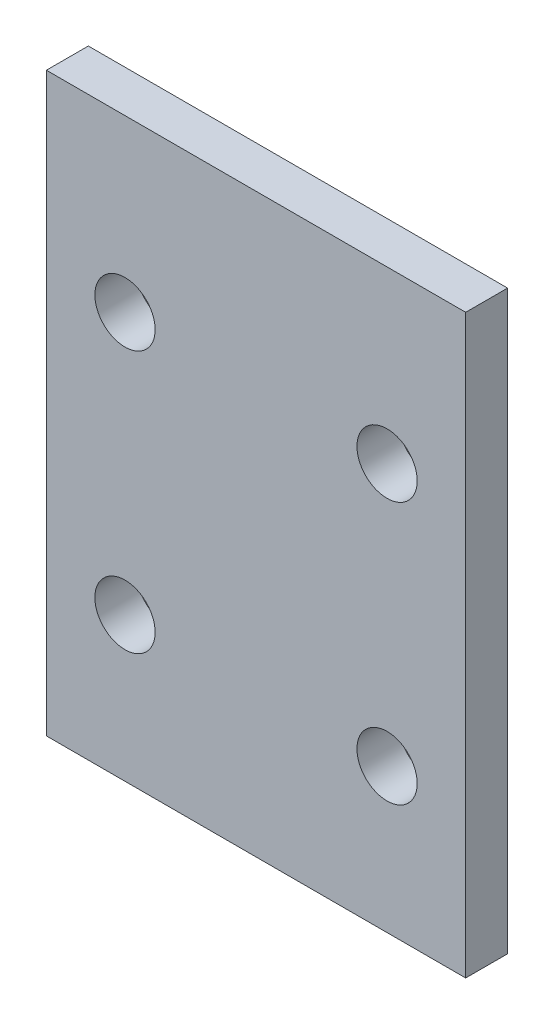
ISO-10303-21;
HEADER;
FILE_DESCRIPTION(('STEP AP214'),'2;1');
FILE_NAME('part.step','',(''),(''),'','','');
FILE_SCHEMA(('AUTOMOTIVE_DESIGN { 1 0 10303 214 1 1 1 1 }'));
ENDSEC;
DATA;
#1=APPLICATION_CONTEXT('core data for automotive mechanical design processes');
#2=APPLICATION_PROTOCOL_DEFINITION('international standard','automotive_design',2000,#1);
#3=PRODUCT_CONTEXT('',#1,'mechanical');
#4=PRODUCT('Part','Part','',(#3));
#5=PRODUCT_RELATED_PRODUCT_CATEGORY('part','',(#4));
#6=PRODUCT_DEFINITION_FORMATION('','',#4);
#7=PRODUCT_DEFINITION_CONTEXT('part definition',#1,'design');
#8=PRODUCT_DEFINITION('design','',#6,#7);
#9=PRODUCT_DEFINITION_SHAPE('','',#8);
#10=(LENGTH_UNIT() NAMED_UNIT(*) SI_UNIT(.MILLI.,.METRE.));
#11=(NAMED_UNIT(*) PLANE_ANGLE_UNIT() SI_UNIT($,.RADIAN.));
#12=(NAMED_UNIT(*) SI_UNIT($,.STERADIAN.) SOLID_ANGLE_UNIT());
#13=UNCERTAINTY_MEASURE_WITH_UNIT(LENGTH_MEASURE(1.E-05),#10,'distance_accuracy_value','');
#14=(GEOMETRIC_REPRESENTATION_CONTEXT(3) GLOBAL_UNCERTAINTY_ASSIGNED_CONTEXT((#13)) GLOBAL_UNIT_ASSIGNED_CONTEXT((#10,
#11,#12)) REPRESENTATION_CONTEXT('',''));
#15=CARTESIAN_POINT('',(0.,0.,0.));
#16=DIRECTION('',(0.,0.,1.));
#17=DIRECTION('',(1.,0.,0.));
#18=AXIS2_PLACEMENT_3D('',#15,#16,#17);
#19=CARTESIAN_POINT('',(0.,0.,16.));
#20=DIRECTION('',(-1.,0.,0.));
#21=DIRECTION('',(0.,0.,-1.));
#22=AXIS2_PLACEMENT_3D('',#19,#20,#21);
#23=PLANE('',#22);
#24=DIRECTION('',(0.,-1.,0.));
#25=VECTOR('',#24,1.);
#26=CARTESIAN_POINT('',(0.,0.,0.));
#27=LINE('',#26,#25);
#28=CARTESIAN_POINT('',(0.,0.,0.));
#29=VERTEX_POINT('',#28);
#30=CARTESIAN_POINT('',(0.,-220.,0.));
#31=VERTEX_POINT('',#30);
#32=EDGE_CURVE('E103',#29,#31,#27,.T.);
#33=ORIENTED_EDGE('',*,*,#32,.T.);
#34=DIRECTION('',(0.,0.,-1.));
#35=VECTOR('',#34,1.);
#36=CARTESIAN_POINT('',(0.,-220.,16.));
#37=LINE('',#36,#35);
#38=CARTESIAN_POINT('',(0.,-220.,16.));
#39=VERTEX_POINT('',#38);
#40=EDGE_CURVE('E96',#39,#31,#37,.T.);
#41=ORIENTED_EDGE('',*,*,#40,.F.);
#42=DIRECTION('',(0.,-1.,0.));
#43=VECTOR('',#42,1.);
#44=CARTESIAN_POINT('',(0.,0.,16.));
#45=LINE('',#44,#43);
#46=CARTESIAN_POINT('',(0.,0.,16.));
#47=VERTEX_POINT('',#46);
#48=EDGE_CURVE('E90',#47,#39,#45,.T.);
#49=ORIENTED_EDGE('',*,*,#48,.F.);
#50=DIRECTION('',(0.,0.,-1.));
#51=VECTOR('',#50,1.);
#52=CARTESIAN_POINT('',(0.,0.,16.));
#53=LINE('',#52,#51);
#54=EDGE_CURVE('E11',#47,#29,#53,.T.);
#55=ORIENTED_EDGE('',*,*,#54,.T.);
#56=EDGE_LOOP('',(#33,#41,#49,#55));
#57=FACE_BOUND('',#56,.T.);
#58=ADVANCED_FACE('F37',(#57),#23,.T.);
#59=CARTESIAN_POINT('',(0.,0.,16.));
#60=DIRECTION('',(0.,1.,0.));
#61=DIRECTION('',(0.,0.,-1.));
#62=AXIS2_PLACEMENT_3D('',#59,#60,#61);
#63=PLANE('',#62);
#64=DIRECTION('',(-1.,0.,0.));
#65=VECTOR('',#64,1.);
#66=CARTESIAN_POINT('',(0.,0.,0.));
#67=LINE('',#66,#65);
#68=CARTESIAN_POINT('',(160.,0.,0.));
#69=VERTEX_POINT('',#68);
#70=EDGE_CURVE('E78',#69,#29,#67,.T.);
#71=ORIENTED_EDGE('',*,*,#70,.T.);
#72=ORIENTED_EDGE('',*,*,#54,.F.);
#73=DIRECTION('',(-1.,0.,0.));
#74=VECTOR('',#73,1.);
#75=CARTESIAN_POINT('',(0.,0.,16.));
#76=LINE('',#75,#74);
#77=CARTESIAN_POINT('',(160.,0.,16.));
#78=VERTEX_POINT('',#77);
#79=EDGE_CURVE('E55',#78,#47,#76,.T.);
#80=ORIENTED_EDGE('',*,*,#79,.F.);
#81=DIRECTION('',(0.,0.,-1.));
#82=VECTOR('',#81,1.);
#83=CARTESIAN_POINT('',(160.,0.,16.));
#84=LINE('',#83,#82);
#85=EDGE_CURVE('E46',#78,#69,#84,.T.);
#86=ORIENTED_EDGE('',*,*,#85,.T.);
#87=EDGE_LOOP('',(#71,#72,#80,#86));
#88=FACE_BOUND('',#87,.T.);
#89=ADVANCED_FACE('F163',(#88),#63,.T.);
#90=CARTESIAN_POINT('',(160.,0.,16.));
#91=DIRECTION('',(1.,0.,0.));
#92=DIRECTION('',(0.,0.,1.));
#93=AXIS2_PLACEMENT_3D('',#90,#91,#92);
#94=PLANE('',#93);
#95=DIRECTION('',(0.,1.,0.));
#96=VECTOR('',#95,1.);
#97=CARTESIAN_POINT('',(160.,0.,0.));
#98=LINE('',#97,#96);
#99=CARTESIAN_POINT('',(160.,-220.,0.));
#100=VERTEX_POINT('',#99);
#101=EDGE_CURVE('E72',#100,#69,#98,.T.);
#102=ORIENTED_EDGE('',*,*,#101,.T.);
#103=ORIENTED_EDGE('',*,*,#85,.F.);
#104=DIRECTION('',(0.,1.,0.));
#105=VECTOR('',#104,1.);
#106=CARTESIAN_POINT('',(160.,0.,16.));
#107=LINE('',#106,#105);
#108=CARTESIAN_POINT('',(160.,-220.,16.));
#109=VERTEX_POINT('',#108);
#110=EDGE_CURVE('E88',#109,#78,#107,.T.);
#111=ORIENTED_EDGE('',*,*,#110,.F.);
#112=DIRECTION('',(0.,0.,-1.));
#113=VECTOR('',#112,1.);
#114=CARTESIAN_POINT('',(160.,-220.,16.));
#115=LINE('',#114,#113);
#116=EDGE_CURVE('E93',#109,#100,#115,.T.);
#117=ORIENTED_EDGE('',*,*,#116,.T.);
#118=EDGE_LOOP('',(#102,#103,#111,#117));
#119=FACE_BOUND('',#118,.T.);
#120=ADVANCED_FACE('F98',(#119),#94,.T.);
#121=CARTESIAN_POINT('',(0.,-220.,16.));
#122=DIRECTION('',(0.,-1.,0.));
#123=DIRECTION('',(0.,0.,1.));
#124=AXIS2_PLACEMENT_3D('',#121,#122,#123);
#125=PLANE('',#124);
#126=DIRECTION('',(1.,0.,0.));
#127=VECTOR('',#126,1.);
#128=CARTESIAN_POINT('',(0.,-220.,0.));
#129=LINE('',#128,#127);
#130=EDGE_CURVE('E95',#31,#100,#129,.T.);
#131=ORIENTED_EDGE('',*,*,#130,.T.);
#132=ORIENTED_EDGE('',*,*,#116,.F.);
#133=DIRECTION('',(1.,0.,0.));
#134=VECTOR('',#133,1.);
#135=CARTESIAN_POINT('',(0.,-220.,16.));
#136=LINE('',#135,#134);
#137=EDGE_CURVE('E85',#39,#109,#136,.T.);
#138=ORIENTED_EDGE('',*,*,#137,.F.);
#139=ORIENTED_EDGE('',*,*,#40,.T.);
#140=EDGE_LOOP('',(#131,#132,#138,#139));
#141=FACE_BOUND('',#140,.T.);
#142=ADVANCED_FACE('F94',(#141),#125,.T.);
#143=CARTESIAN_POINT('',(0.,0.,16.));
#144=DIRECTION('',(0.,0.,-1.));
#145=DIRECTION('',(1.,0.,0.));
#146=AXIS2_PLACEMENT_3D('',#143,#144,#145);
#147=PLANE('',#146);
#148=CARTESIAN_POINT('',(30.0000000000004,-65.,16.));
#149=DIRECTION('',(0.,0.,-1.));
#150=DIRECTION('',(-1.,0.,0.));
#151=AXIS2_PLACEMENT_3D('',#148,#149,#150);
#152=CIRCLE('',#151,11.5);
#153=CARTESIAN_POINT('',(18.5000000000003,-65.,16.));
#154=VERTEX_POINT('',#153);
#155=EDGE_CURVE('E133',#154,#154,#152,.T.);
#156=ORIENTED_EDGE('',*,*,#155,.T.);
#157=EDGE_LOOP('',(#156));
#158=FACE_BOUND('',#157,.T.);
#159=CARTESIAN_POINT('',(130.,-165.,16.));
#160=DIRECTION('',(0.,0.,-1.));
#161=DIRECTION('',(1.,0.,0.));
#162=AXIS2_PLACEMENT_3D('',#159,#160,#161);
#163=CIRCLE('',#162,11.5);
#164=CARTESIAN_POINT('',(141.5,-165.,16.));
#165=VERTEX_POINT('',#164);
#166=EDGE_CURVE('E135',#165,#165,#163,.T.);
#167=ORIENTED_EDGE('',*,*,#166,.T.);
#168=EDGE_LOOP('',(#167));
#169=FACE_BOUND('',#168,.T.);
#170=CARTESIAN_POINT('',(130.,-65.,16.));
#171=DIRECTION('',(0.,0.,-1.));
#172=DIRECTION('',(1.,0.,0.));
#173=AXIS2_PLACEMENT_3D('',#170,#171,#172);
#174=CIRCLE('',#173,11.5);
#175=CARTESIAN_POINT('',(141.5,-65.,16.));
#176=VERTEX_POINT('',#175);
#177=EDGE_CURVE('E140',#176,#176,#174,.T.);
#178=ORIENTED_EDGE('',*,*,#177,.T.);
#179=EDGE_LOOP('',(#178));
#180=FACE_BOUND('',#179,.T.);
#181=CARTESIAN_POINT('',(30.,-165.,16.));
#182=DIRECTION('',(0.,0.,-1.));
#183=DIRECTION('',(-1.,0.,0.));
#184=AXIS2_PLACEMENT_3D('',#181,#182,#183);
#185=CIRCLE('',#184,11.5);
#186=CARTESIAN_POINT('',(18.5,-165.,16.));
#187=VERTEX_POINT('',#186);
#188=EDGE_CURVE('E115',#187,#187,#185,.T.);
#189=ORIENTED_EDGE('',*,*,#188,.T.);
#190=EDGE_LOOP('',(#189));
#191=FACE_BOUND('',#190,.T.);
#192=ORIENTED_EDGE('',*,*,#48,.T.);
#193=ORIENTED_EDGE('',*,*,#137,.T.);
#194=ORIENTED_EDGE('',*,*,#110,.T.);
#195=ORIENTED_EDGE('',*,*,#79,.T.);
#196=EDGE_LOOP('',(#192,#193,#194,#195));
#197=FACE_BOUND('',#196,.T.);
#198=ADVANCED_FACE('F86',(#158,#169,#180,#191,#197),#147,.F.);
#199=CARTESIAN_POINT('',(0.,0.,0.));
#200=DIRECTION('',(0.,0.,-1.));
#201=DIRECTION('',(1.,0.,0.));
#202=AXIS2_PLACEMENT_3D('',#199,#200,#201);
#203=PLANE('',#202);
#204=CARTESIAN_POINT('',(30.0000000000004,-65.,0.));
#205=DIRECTION('',(0.,0.,1.));
#206=DIRECTION('',(1.,0.,0.));
#207=AXIS2_PLACEMENT_3D('',#204,#205,#206);
#208=CIRCLE('',#207,11.5);
#209=CARTESIAN_POINT('',(41.5000000000004,-65.,0.));
#210=VERTEX_POINT('',#209);
#211=EDGE_CURVE('E40',#210,#210,#208,.T.);
#212=ORIENTED_EDGE('',*,*,#211,.T.);
#213=EDGE_LOOP('',(#212));
#214=FACE_BOUND('',#213,.T.);
#215=CARTESIAN_POINT('',(130.,-165.,0.));
#216=DIRECTION('',(0.,0.,1.));
#217=DIRECTION('',(1.,0.,0.));
#218=AXIS2_PLACEMENT_3D('',#215,#216,#217);
#219=CIRCLE('',#218,11.5);
#220=CARTESIAN_POINT('',(141.5,-165.,0.));
#221=VERTEX_POINT('',#220);
#222=EDGE_CURVE('E117',#221,#221,#219,.T.);
#223=ORIENTED_EDGE('',*,*,#222,.T.);
#224=EDGE_LOOP('',(#223));
#225=FACE_BOUND('',#224,.T.);
#226=CARTESIAN_POINT('',(130.,-65.,0.));
#227=DIRECTION('',(0.,0.,1.));
#228=DIRECTION('',(1.,0.,0.));
#229=AXIS2_PLACEMENT_3D('',#226,#227,#228);
#230=CIRCLE('',#229,11.5);
#231=CARTESIAN_POINT('',(141.5,-65.,0.));
#232=VERTEX_POINT('',#231);
#233=EDGE_CURVE('E114',#232,#232,#230,.T.);
#234=ORIENTED_EDGE('',*,*,#233,.T.);
#235=EDGE_LOOP('',(#234));
#236=FACE_BOUND('',#235,.T.);
#237=CARTESIAN_POINT('',(30.,-165.,0.));
#238=DIRECTION('',(0.,0.,1.));
#239=DIRECTION('',(1.,0.,0.));
#240=AXIS2_PLACEMENT_3D('',#237,#238,#239);
#241=CIRCLE('',#240,11.5);
#242=CARTESIAN_POINT('',(41.5,-165.,0.));
#243=VERTEX_POINT('',#242);
#244=EDGE_CURVE('E111',#243,#243,#241,.T.);
#245=ORIENTED_EDGE('',*,*,#244,.T.);
#246=EDGE_LOOP('',(#245));
#247=FACE_BOUND('',#246,.T.);
#248=ORIENTED_EDGE('',*,*,#32,.F.);
#249=ORIENTED_EDGE('',*,*,#70,.F.);
#250=ORIENTED_EDGE('',*,*,#101,.F.);
#251=ORIENTED_EDGE('',*,*,#130,.F.);
#252=EDGE_LOOP('',(#248,#249,#250,#251));
#253=FACE_BOUND('',#252,.T.);
#254=ADVANCED_FACE('F124',(#214,#225,#236,#247,#253),#203,.T.);
#255=CARTESIAN_POINT('',(30.,-165.,-14.));
#256=DIRECTION('',(0.,0.,1.));
#257=DIRECTION('',(-1.,0.,0.));
#258=AXIS2_PLACEMENT_3D('',#255,#256,#257);
#259=CYLINDRICAL_SURFACE('',#258,11.5);
#260=ORIENTED_EDGE('',*,*,#244,.F.);
#261=EDGE_LOOP('',(#260));
#262=FACE_BOUND('',#261,.T.);
#263=ORIENTED_EDGE('',*,*,#188,.F.);
#264=EDGE_LOOP('',(#263));
#265=FACE_BOUND('',#264,.T.);
#266=ADVANCED_FACE('F150',(#262,#265),#259,.F.);
#267=CARTESIAN_POINT('',(130.,-65.,-14.));
#268=DIRECTION('',(0.,0.,1.));
#269=DIRECTION('',(-1.,0.,0.));
#270=AXIS2_PLACEMENT_3D('',#267,#268,#269);
#271=CYLINDRICAL_SURFACE('',#270,11.5);
#272=ORIENTED_EDGE('',*,*,#233,.F.);
#273=EDGE_LOOP('',(#272));
#274=FACE_BOUND('',#273,.T.);
#275=ORIENTED_EDGE('',*,*,#177,.F.);
#276=EDGE_LOOP('',(#275));
#277=FACE_BOUND('',#276,.T.);
#278=ADVANCED_FACE('F148',(#274,#277),#271,.F.);
#279=CARTESIAN_POINT('',(130.,-165.,-14.));
#280=DIRECTION('',(0.,0.,1.));
#281=DIRECTION('',(-1.,0.,0.));
#282=AXIS2_PLACEMENT_3D('',#279,#280,#281);
#283=CYLINDRICAL_SURFACE('',#282,11.5);
#284=ORIENTED_EDGE('',*,*,#222,.F.);
#285=EDGE_LOOP('',(#284));
#286=FACE_BOUND('',#285,.T.);
#287=ORIENTED_EDGE('',*,*,#166,.F.);
#288=EDGE_LOOP('',(#287));
#289=FACE_BOUND('',#288,.T.);
#290=ADVANCED_FACE('F129',(#286,#289),#283,.F.);
#291=CARTESIAN_POINT('',(30.0000000000004,-65.,-14.));
#292=DIRECTION('',(0.,0.,1.));
#293=DIRECTION('',(-1.,0.,0.));
#294=AXIS2_PLACEMENT_3D('',#291,#292,#293);
#295=CYLINDRICAL_SURFACE('',#294,11.5);
#296=ORIENTED_EDGE('',*,*,#211,.F.);
#297=EDGE_LOOP('',(#296));
#298=FACE_BOUND('',#297,.T.);
#299=ORIENTED_EDGE('',*,*,#155,.F.);
#300=EDGE_LOOP('',(#299));
#301=FACE_BOUND('',#300,.T.);
#302=ADVANCED_FACE('F126',(#298,#301),#295,.F.);
#303=CLOSED_SHELL('',(#58,#89,#120,#142,#198,#254,#266,#278,#290,#302));
#304=MANIFOLD_SOLID_BREP('B2',#303);
#305=ADVANCED_BREP_SHAPE_REPRESENTATION('',(#18,#304),#14);
#306=SHAPE_DEFINITION_REPRESENTATION(#9,#305);
ENDSEC;
END-ISO-10303-21;
